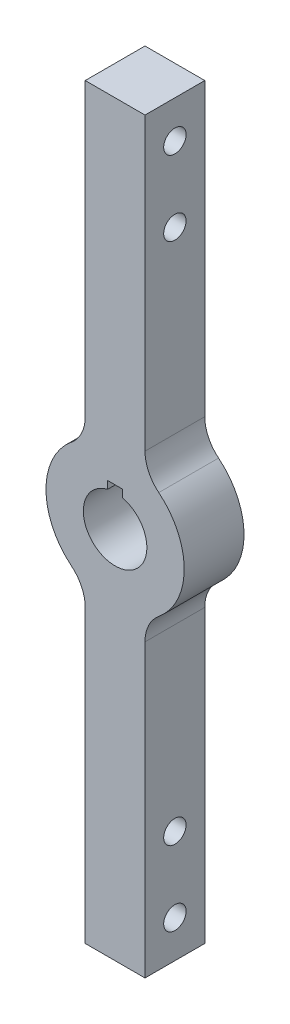
ISO-10303-21;
HEADER;
FILE_DESCRIPTION(('STEP AP214'),'2;1');
FILE_NAME('part.step','',(''),(''),'','','');
FILE_SCHEMA(('AUTOMOTIVE_DESIGN { 1 0 10303 214 1 1 1 1 }'));
ENDSEC;
DATA;
#1=APPLICATION_CONTEXT('core data for automotive mechanical design processes');
#2=APPLICATION_PROTOCOL_DEFINITION('international standard','automotive_design',2000,#1);
#3=PRODUCT_CONTEXT('',#1,'mechanical');
#4=PRODUCT('Part','Part','',(#3));
#5=PRODUCT_RELATED_PRODUCT_CATEGORY('part','',(#4));
#6=PRODUCT_DEFINITION_FORMATION('','',#4);
#7=PRODUCT_DEFINITION_CONTEXT('part definition',#1,'design');
#8=PRODUCT_DEFINITION('design','',#6,#7);
#9=PRODUCT_DEFINITION_SHAPE('','',#8);
#10=(LENGTH_UNIT() NAMED_UNIT(*) SI_UNIT(.MILLI.,.METRE.));
#11=(NAMED_UNIT(*) PLANE_ANGLE_UNIT() SI_UNIT($,.RADIAN.));
#12=(NAMED_UNIT(*) SI_UNIT($,.STERADIAN.) SOLID_ANGLE_UNIT());
#13=UNCERTAINTY_MEASURE_WITH_UNIT(LENGTH_MEASURE(1.E-05),#10,'distance_accuracy_value','');
#14=(GEOMETRIC_REPRESENTATION_CONTEXT(3) GLOBAL_UNCERTAINTY_ASSIGNED_CONTEXT((#13)) GLOBAL_UNIT_ASSIGNED_CONTEXT((#10,
#11,#12)) REPRESENTATION_CONTEXT('',''));
#15=CARTESIAN_POINT('',(0.,0.,0.));
#16=DIRECTION('',(0.,0.,1.));
#17=DIRECTION('',(1.,0.,0.));
#18=AXIS2_PLACEMENT_3D('',#15,#16,#17);
#19=CARTESIAN_POINT('',(0.,0.,8.));
#20=DIRECTION('',(0.,0.,-1.));
#21=DIRECTION('',(-1.,0.,0.));
#22=AXIS2_PLACEMENT_3D('',#19,#20,#21);
#23=CYLINDRICAL_SURFACE('',#22,18.5);
#24=CARTESIAN_POINT('',(0.,0.,8.));
#25=DIRECTION('',(0.,0.,1.));
#26=DIRECTION('',(1.,0.,0.));
#27=AXIS2_PLACEMENT_3D('',#24,#25,#26);
#28=CIRCLE('',#27,18.5);
#29=CARTESIAN_POINT('',(11.6842105263158,-14.3432640767969,8.));
#30=VERTEX_POINT('',#29);
#31=CARTESIAN_POINT('',(11.6842105263158,14.3432640767969,8.));
#32=VERTEX_POINT('',#31);
#33=EDGE_CURVE('E199',#30,#32,#28,.T.);
#34=ORIENTED_EDGE('',*,*,#33,.F.);
#35=DIRECTION('',(0.,0.,-1.));
#36=VECTOR('',#35,1.);
#37=CARTESIAN_POINT('',(11.6842105263158,-14.3432640767969,8.));
#38=LINE('',#37,#36);
#39=CARTESIAN_POINT('',(11.6842105263158,-14.3432640767969,-8.));
#40=VERTEX_POINT('',#39);
#41=EDGE_CURVE('E203',#30,#40,#38,.T.);
#42=ORIENTED_EDGE('',*,*,#41,.T.);
#43=CARTESIAN_POINT('',(0.,0.,-8.));
#44=DIRECTION('',(0.,0.,1.));
#45=DIRECTION('',(1.,0.,0.));
#46=AXIS2_PLACEMENT_3D('',#43,#44,#45);
#47=CIRCLE('',#46,18.5);
#48=CARTESIAN_POINT('',(11.6842105263158,14.3432640767969,-8.));
#49=VERTEX_POINT('',#48);
#50=EDGE_CURVE('E185',#40,#49,#47,.T.);
#51=ORIENTED_EDGE('',*,*,#50,.T.);
#52=DIRECTION('',(0.,0.,-1.));
#53=VECTOR('',#52,1.);
#54=CARTESIAN_POINT('',(11.6842105263158,14.3432640767969,8.));
#55=LINE('',#54,#53);
#56=EDGE_CURVE('E198',#49,#32,#55,.F.);
#57=ORIENTED_EDGE('',*,*,#56,.T.);
#58=EDGE_LOOP('',(#34,#42,#51,#57));
#59=FACE_BOUND('',#58,.T.);
#60=ADVANCED_FACE('F46',(#59),#23,.T.);
#61=CARTESIAN_POINT('',(-11.6842105263158,14.3432640767969,-8.));
#62=VERTEX_POINT('',#61);
#63=CARTESIAN_POINT('',(-11.6842105263158,-14.3432640767969,-8.));
#64=VERTEX_POINT('',#63);
#65=EDGE_CURVE('E189',#62,#64,#47,.T.);
#66=ORIENTED_EDGE('',*,*,#65,.T.);
#67=DIRECTION('',(0.,0.,-1.));
#68=VECTOR('',#67,1.);
#69=CARTESIAN_POINT('',(-11.6842105263158,-14.3432640767969,8.));
#70=LINE('',#69,#68);
#71=CARTESIAN_POINT('',(-11.6842105263158,-14.3432640767969,8.));
#72=VERTEX_POINT('',#71);
#73=EDGE_CURVE('E214',#64,#72,#70,.F.);
#74=ORIENTED_EDGE('',*,*,#73,.T.);
#75=CARTESIAN_POINT('',(-11.6842105263158,14.3432640767969,8.));
#76=VERTEX_POINT('',#75);
#77=EDGE_CURVE('E196',#76,#72,#28,.T.);
#78=ORIENTED_EDGE('',*,*,#77,.F.);
#79=DIRECTION('',(0.,0.,-1.));
#80=VECTOR('',#79,1.);
#81=CARTESIAN_POINT('',(-11.6842105263158,14.3432640767969,8.));
#82=LINE('',#81,#80);
#83=EDGE_CURVE('E211',#76,#62,#82,.T.);
#84=ORIENTED_EDGE('',*,*,#83,.T.);
#85=EDGE_LOOP('',(#66,#74,#78,#84));
#86=FACE_BOUND('',#85,.T.);
#87=ADVANCED_FACE('F332',(#86),#23,.T.);
#88=CARTESIAN_POINT('',(0.,0.,8.));
#89=DIRECTION('',(0.,0.,1.));
#90=DIRECTION('',(1.,0.,0.));
#91=AXIS2_PLACEMENT_3D('',#88,#89,#90);
#92=PLANE('',#91);
#93=DIRECTION('',(0.,-1.,0.));
#94=VECTOR('',#93,1.);
#95=CARTESIAN_POINT('',(2.,10.3,8.));
#96=LINE('',#95,#94);
#97=CARTESIAN_POINT('',(2.,10.3,8.));
#98=VERTEX_POINT('',#97);
#99=CARTESIAN_POINT('',(2.,8.26135582092915,8.));
#100=VERTEX_POINT('',#99);
#101=EDGE_CURVE('E163',#98,#100,#96,.T.);
#102=ORIENTED_EDGE('',*,*,#101,.T.);
#103=CARTESIAN_POINT('',(0.,0.,8.));
#104=DIRECTION('',(0.,0.,1.));
#105=DIRECTION('',(1.,0.,0.));
#106=AXIS2_PLACEMENT_3D('',#103,#104,#105);
#107=CIRCLE('',#106,8.5);
#108=CARTESIAN_POINT('',(-2.,8.26135582092915,8.));
#109=VERTEX_POINT('',#108);
#110=EDGE_CURVE('E178',#109,#100,#107,.T.);
#111=ORIENTED_EDGE('',*,*,#110,.F.);
#112=DIRECTION('',(0.,1.,0.));
#113=VECTOR('',#112,1.);
#114=CARTESIAN_POINT('',(-2.,10.3,8.));
#115=LINE('',#114,#113);
#116=CARTESIAN_POINT('',(-2.,10.3,8.));
#117=VERTEX_POINT('',#116);
#118=EDGE_CURVE('E180',#109,#117,#115,.T.);
#119=ORIENTED_EDGE('',*,*,#118,.T.);
#120=DIRECTION('',(1.,0.,0.));
#121=VECTOR('',#120,1.);
#122=CARTESIAN_POINT('',(-2.,10.3,8.));
#123=LINE('',#122,#121);
#124=EDGE_CURVE('E172',#117,#98,#123,.T.);
#125=ORIENTED_EDGE('',*,*,#124,.T.);
#126=EDGE_LOOP('',(#102,#111,#119,#125));
#127=FACE_BOUND('',#126,.T.);
#128=DIRECTION('',(0.,-1.,0.));
#129=VECTOR('',#128,1.);
#130=CARTESIAN_POINT('',(-8.,100.,8.));
#131=LINE('',#130,#129);
#132=CARTESIAN_POINT('',(-8.,100.,8.));
#133=VERTEX_POINT('',#132);
#134=CARTESIAN_POINT('',(-7.99999999999999,22.0963797939844,8.));
#135=VERTEX_POINT('',#134);
#136=EDGE_CURVE('E296',#133,#135,#131,.T.);
#137=ORIENTED_EDGE('',*,*,#136,.T.);
#138=CARTESIAN_POINT('',(-18.,22.0963797939844,8.));
#139=DIRECTION('',(0.,0.,1.));
#140=DIRECTION('',(1.,0.,0.));
#141=AXIS2_PLACEMENT_3D('',#138,#139,#140);
#142=CIRCLE('',#141,10.);
#143=EDGE_CURVE('E230',#135,#76,#142,.F.);
#144=ORIENTED_EDGE('',*,*,#143,.T.);
#145=ORIENTED_EDGE('',*,*,#77,.T.);
#146=CARTESIAN_POINT('',(-18.,-22.0963797939843,8.));
#147=DIRECTION('',(0.,0.,1.));
#148=DIRECTION('',(1.,0.,0.));
#149=AXIS2_PLACEMENT_3D('',#146,#147,#148);
#150=CIRCLE('',#149,10.);
#151=CARTESIAN_POINT('',(-8.00000000000001,-22.0963797939844,8.));
#152=VERTEX_POINT('',#151);
#153=EDGE_CURVE('E226',#72,#152,#150,.F.);
#154=ORIENTED_EDGE('',*,*,#153,.T.);
#155=DIRECTION('',(0.,-1.,0.));
#156=VECTOR('',#155,1.);
#157=CARTESIAN_POINT('',(-7.99999999999999,-100.,8.));
#158=LINE('',#157,#156);
#159=CARTESIAN_POINT('',(-7.99999999999999,-100.,8.));
#160=VERTEX_POINT('',#159);
#161=EDGE_CURVE('E274',#152,#160,#158,.T.);
#162=ORIENTED_EDGE('',*,*,#161,.T.);
#163=DIRECTION('',(1.,0.,0.));
#164=VECTOR('',#163,1.);
#165=CARTESIAN_POINT('',(-7.99999999999999,-100.,8.));
#166=LINE('',#165,#164);
#167=CARTESIAN_POINT('',(8.00000000000001,-100.,8.));
#168=VERTEX_POINT('',#167);
#169=EDGE_CURVE('E277',#160,#168,#166,.T.);
#170=ORIENTED_EDGE('',*,*,#169,.T.);
#171=DIRECTION('',(0.,1.,0.));
#172=VECTOR('',#171,1.);
#173=CARTESIAN_POINT('',(8.00000000000001,-100.,8.));
#174=LINE('',#173,#172);
#175=CARTESIAN_POINT('',(8.00000000000001,-22.0963797939843,8.));
#176=VERTEX_POINT('',#175);
#177=EDGE_CURVE('E271',#168,#176,#174,.T.);
#178=ORIENTED_EDGE('',*,*,#177,.T.);
#179=CARTESIAN_POINT('',(18.,-22.0963797939843,8.));
#180=DIRECTION('',(0.,0.,1.));
#181=DIRECTION('',(1.,0.,0.));
#182=AXIS2_PLACEMENT_3D('',#179,#180,#181);
#183=CIRCLE('',#182,10.);
#184=EDGE_CURVE('E222',#176,#30,#183,.F.);
#185=ORIENTED_EDGE('',*,*,#184,.T.);
#186=ORIENTED_EDGE('',*,*,#33,.T.);
#187=CARTESIAN_POINT('',(18.,22.0963797939844,8.));
#188=DIRECTION('',(0.,0.,1.));
#189=DIRECTION('',(1.,0.,0.));
#190=AXIS2_PLACEMENT_3D('',#187,#188,#189);
#191=CIRCLE('',#190,10.);
#192=CARTESIAN_POINT('',(7.99999999999999,22.0963797939844,8.));
#193=VERTEX_POINT('',#192);
#194=EDGE_CURVE('E13',#32,#193,#191,.F.);
#195=ORIENTED_EDGE('',*,*,#194,.T.);
#196=DIRECTION('',(0.,1.,0.));
#197=VECTOR('',#196,1.);
#198=CARTESIAN_POINT('',(8.,100.,8.));
#199=LINE('',#198,#197);
#200=CARTESIAN_POINT('',(8.,100.,8.));
#201=VERTEX_POINT('',#200);
#202=EDGE_CURVE('E291',#193,#201,#199,.T.);
#203=ORIENTED_EDGE('',*,*,#202,.T.);
#204=DIRECTION('',(-1.,0.,0.));
#205=VECTOR('',#204,1.);
#206=CARTESIAN_POINT('',(-8.,100.,8.));
#207=LINE('',#206,#205);
#208=EDGE_CURVE('E293',#201,#133,#207,.T.);
#209=ORIENTED_EDGE('',*,*,#208,.T.);
#210=EDGE_LOOP('',(#137,#144,#145,#154,#162,#170,#178,#185,#186,#195,#203,#209));
#211=FACE_BOUND('',#210,.T.);
#212=ADVANCED_FACE('F176',(#127,#211),#92,.T.);
#213=CARTESIAN_POINT('',(0.,0.,-8.));
#214=DIRECTION('',(0.,0.,1.));
#215=DIRECTION('',(1.,0.,0.));
#216=AXIS2_PLACEMENT_3D('',#213,#214,#215);
#217=PLANE('',#216);
#218=ORIENTED_EDGE('',*,*,#50,.F.);
#219=CARTESIAN_POINT('',(18.,-22.0963797939843,-8.));
#220=DIRECTION('',(0.,0.,1.));
#221=DIRECTION('',(1.,0.,0.));
#222=AXIS2_PLACEMENT_3D('',#219,#220,#221);
#223=CIRCLE('',#222,10.);
#224=CARTESIAN_POINT('',(8.00000000000001,-22.0963797939843,-8.));
#225=VERTEX_POINT('',#224);
#226=EDGE_CURVE('E220',#40,#225,#223,.T.);
#227=ORIENTED_EDGE('',*,*,#226,.T.);
#228=DIRECTION('',(0.,1.,0.));
#229=VECTOR('',#228,1.);
#230=CARTESIAN_POINT('',(8.00000000000001,-100.,-8.));
#231=LINE('',#230,#229);
#232=CARTESIAN_POINT('',(8.00000000000001,-100.,-8.));
#233=VERTEX_POINT('',#232);
#234=EDGE_CURVE('E267',#233,#225,#231,.T.);
#235=ORIENTED_EDGE('',*,*,#234,.F.);
#236=DIRECTION('',(1.,0.,0.));
#237=VECTOR('',#236,1.);
#238=CARTESIAN_POINT('',(-7.99999999999999,-100.,-8.));
#239=LINE('',#238,#237);
#240=CARTESIAN_POINT('',(-7.99999999999999,-100.,-8.));
#241=VERTEX_POINT('',#240);
#242=EDGE_CURVE('E275',#241,#233,#239,.T.);
#243=ORIENTED_EDGE('',*,*,#242,.F.);
#244=DIRECTION('',(0.,-1.,0.));
#245=VECTOR('',#244,1.);
#246=CARTESIAN_POINT('',(-7.99999999999999,-100.,-8.));
#247=LINE('',#246,#245);
#248=CARTESIAN_POINT('',(-8.00000000000001,-22.0963797939844,-8.));
#249=VERTEX_POINT('',#248);
#250=EDGE_CURVE('E282',#249,#241,#247,.T.);
#251=ORIENTED_EDGE('',*,*,#250,.F.);
#252=CARTESIAN_POINT('',(-18.,-22.0963797939843,-8.));
#253=DIRECTION('',(0.,0.,1.));
#254=DIRECTION('',(1.,0.,0.));
#255=AXIS2_PLACEMENT_3D('',#252,#253,#254);
#256=CIRCLE('',#255,10.);
#257=EDGE_CURVE('E224',#249,#64,#256,.T.);
#258=ORIENTED_EDGE('',*,*,#257,.T.);
#259=ORIENTED_EDGE('',*,*,#65,.F.);
#260=CARTESIAN_POINT('',(-18.,22.0963797939844,-8.));
#261=DIRECTION('',(0.,0.,1.));
#262=DIRECTION('',(1.,0.,0.));
#263=AXIS2_PLACEMENT_3D('',#260,#261,#262);
#264=CIRCLE('',#263,10.);
#265=CARTESIAN_POINT('',(-7.99999999999999,22.0963797939844,-8.));
#266=VERTEX_POINT('',#265);
#267=EDGE_CURVE('E228',#62,#266,#264,.T.);
#268=ORIENTED_EDGE('',*,*,#267,.T.);
#269=DIRECTION('',(0.,-1.,0.));
#270=VECTOR('',#269,1.);
#271=CARTESIAN_POINT('',(-8.,100.,-8.));
#272=LINE('',#271,#270);
#273=CARTESIAN_POINT('',(-8.,100.,-8.));
#274=VERTEX_POINT('',#273);
#275=EDGE_CURVE('E294',#274,#266,#272,.T.);
#276=ORIENTED_EDGE('',*,*,#275,.F.);
#277=DIRECTION('',(-1.,0.,0.));
#278=VECTOR('',#277,1.);
#279=CARTESIAN_POINT('',(-8.,100.,-8.));
#280=LINE('',#279,#278);
#281=CARTESIAN_POINT('',(8.,100.,-8.));
#282=VERTEX_POINT('',#281);
#283=EDGE_CURVE('E301',#282,#274,#280,.T.);
#284=ORIENTED_EDGE('',*,*,#283,.F.);
#285=DIRECTION('',(0.,1.,0.));
#286=VECTOR('',#285,1.);
#287=CARTESIAN_POINT('',(8.,100.,-8.));
#288=LINE('',#287,#286);
#289=CARTESIAN_POINT('',(7.99999999999999,22.0963797939844,-8.));
#290=VERTEX_POINT('',#289);
#291=EDGE_CURVE('E290',#290,#282,#288,.T.);
#292=ORIENTED_EDGE('',*,*,#291,.F.);
#293=CARTESIAN_POINT('',(18.,22.0963797939844,-8.));
#294=DIRECTION('',(0.,0.,1.));
#295=DIRECTION('',(1.,0.,0.));
#296=AXIS2_PLACEMENT_3D('',#293,#294,#295);
#297=CIRCLE('',#296,10.);
#298=EDGE_CURVE('E55',#290,#49,#297,.T.);
#299=ORIENTED_EDGE('',*,*,#298,.T.);
#300=EDGE_LOOP('',(#218,#227,#235,#243,#251,#258,#259,#268,#276,#284,#292,#299));
#301=FACE_BOUND('',#300,.T.);
#302=CARTESIAN_POINT('',(0.,0.,-8.));
#303=DIRECTION('',(0.,0.,1.));
#304=DIRECTION('',(1.,0.,0.));
#305=AXIS2_PLACEMENT_3D('',#302,#303,#304);
#306=CIRCLE('',#305,8.5);
#307=CARTESIAN_POINT('',(-2.,8.26135582092915,-8.));
#308=VERTEX_POINT('',#307);
#309=CARTESIAN_POINT('',(2.,8.26135582092915,-8.));
#310=VERTEX_POINT('',#309);
#311=EDGE_CURVE('E186',#308,#310,#306,.T.);
#312=ORIENTED_EDGE('',*,*,#311,.T.);
#313=DIRECTION('',(0.,-1.,0.));
#314=VECTOR('',#313,1.);
#315=CARTESIAN_POINT('',(2.,10.3,-8.));
#316=LINE('',#315,#314);
#317=CARTESIAN_POINT('',(2.,10.3,-8.));
#318=VERTEX_POINT('',#317);
#319=EDGE_CURVE('E166',#318,#310,#316,.T.);
#320=ORIENTED_EDGE('',*,*,#319,.F.);
#321=DIRECTION('',(1.,0.,0.));
#322=VECTOR('',#321,1.);
#323=CARTESIAN_POINT('',(-2.,10.3,-8.));
#324=LINE('',#323,#322);
#325=CARTESIAN_POINT('',(-2.,10.3,-8.));
#326=VERTEX_POINT('',#325);
#327=EDGE_CURVE('E181',#326,#318,#324,.T.);
#328=ORIENTED_EDGE('',*,*,#327,.F.);
#329=DIRECTION('',(0.,1.,0.));
#330=VECTOR('',#329,1.);
#331=CARTESIAN_POINT('',(-2.,10.3,-8.));
#332=LINE('',#331,#330);
#333=EDGE_CURVE('E260',#308,#326,#332,.T.);
#334=ORIENTED_EDGE('',*,*,#333,.F.);
#335=EDGE_LOOP('',(#312,#320,#328,#334));
#336=FACE_BOUND('',#335,.T.);
#337=ADVANCED_FACE('F320',(#301,#336),#217,.F.);
#338=CARTESIAN_POINT('',(0.,0.,8.));
#339=DIRECTION('',(0.,0.,-1.));
#340=DIRECTION('',(-1.,0.,0.));
#341=AXIS2_PLACEMENT_3D('',#338,#339,#340);
#342=CYLINDRICAL_SURFACE('',#341,8.5);
#343=DIRECTION('',(0.,0.,-1.));
#344=VECTOR('',#343,1.);
#345=CARTESIAN_POINT('',(-2.,8.26135582092915,8.));
#346=LINE('',#345,#344);
#347=EDGE_CURVE('E171',#109,#308,#346,.T.);
#348=ORIENTED_EDGE('',*,*,#347,.F.);
#349=ORIENTED_EDGE('',*,*,#110,.T.);
#350=DIRECTION('',(0.,0.,-1.));
#351=VECTOR('',#350,1.);
#352=CARTESIAN_POINT('',(2.,8.26135582092915,8.));
#353=LINE('',#352,#351);
#354=EDGE_CURVE('E160',#100,#310,#353,.T.);
#355=ORIENTED_EDGE('',*,*,#354,.T.);
#356=ORIENTED_EDGE('',*,*,#311,.F.);
#357=EDGE_LOOP('',(#348,#349,#355,#356));
#358=FACE_BOUND('',#357,.T.);
#359=ADVANCED_FACE('F184',(#358),#342,.F.);
#360=CARTESIAN_POINT('',(8.,100.,8.));
#361=DIRECTION('',(-1.,0.,0.));
#362=DIRECTION('',(0.,-1.,0.));
#363=AXIS2_PLACEMENT_3D('',#360,#361,#362);
#364=PLANE('',#363);
#365=CARTESIAN_POINT('',(8.00000000000001,70.,0.));
#366=DIRECTION('',(1.,0.,0.));
#367=DIRECTION('',(0.,1.,0.));
#368=AXIS2_PLACEMENT_3D('',#365,#366,#367);
#369=CIRCLE('',#368,3.);
#370=CARTESIAN_POINT('',(8.00000000000001,73.,0.));
#371=VERTEX_POINT('',#370);
#372=EDGE_CURVE('E239',#371,#371,#369,.T.);
#373=ORIENTED_EDGE('',*,*,#372,.F.);
#374=EDGE_LOOP('',(#373));
#375=FACE_BOUND('',#374,.T.);
#376=CARTESIAN_POINT('',(8.,90.,0.));
#377=DIRECTION('',(1.,0.,0.));
#378=DIRECTION('',(0.,1.,0.));
#379=AXIS2_PLACEMENT_3D('',#376,#377,#378);
#380=CIRCLE('',#379,3.);
#381=CARTESIAN_POINT('',(8.,93.,0.));
#382=VERTEX_POINT('',#381);
#383=EDGE_CURVE('E236',#382,#382,#380,.T.);
#384=ORIENTED_EDGE('',*,*,#383,.F.);
#385=EDGE_LOOP('',(#384));
#386=FACE_BOUND('',#385,.T.);
#387=ORIENTED_EDGE('',*,*,#202,.F.);
#388=DIRECTION('',(0.,0.,1.));
#389=VECTOR('',#388,1.);
#390=CARTESIAN_POINT('',(7.99999999999999,22.0963797939844,-8.));
#391=LINE('',#390,#389);
#392=EDGE_CURVE('E218',#193,#290,#391,.F.);
#393=ORIENTED_EDGE('',*,*,#392,.T.);
#394=ORIENTED_EDGE('',*,*,#291,.T.);
#395=DIRECTION('',(0.,0.,-1.));
#396=VECTOR('',#395,1.);
#397=CARTESIAN_POINT('',(8.,100.,8.));
#398=LINE('',#397,#396);
#399=EDGE_CURVE('E191',#201,#282,#398,.T.);
#400=ORIENTED_EDGE('',*,*,#399,.F.);
#401=EDGE_LOOP('',(#387,#393,#394,#400));
#402=FACE_BOUND('',#401,.T.);
#403=ADVANCED_FACE('F316',(#375,#386,#402),#364,.F.);
#404=CARTESIAN_POINT('',(-8.,100.,8.));
#405=DIRECTION('',(0.,-1.,0.));
#406=DIRECTION('',(0.,0.,-1.));
#407=AXIS2_PLACEMENT_3D('',#404,#405,#406);
#408=PLANE('',#407);
#409=ORIENTED_EDGE('',*,*,#283,.T.);
#410=DIRECTION('',(0.,0.,-1.));
#411=VECTOR('',#410,1.);
#412=CARTESIAN_POINT('',(-8.,100.,8.));
#413=LINE('',#412,#411);
#414=EDGE_CURVE('E299',#133,#274,#413,.T.);
#415=ORIENTED_EDGE('',*,*,#414,.F.);
#416=ORIENTED_EDGE('',*,*,#208,.F.);
#417=ORIENTED_EDGE('',*,*,#399,.T.);
#418=EDGE_LOOP('',(#409,#415,#416,#417));
#419=FACE_BOUND('',#418,.T.);
#420=ADVANCED_FACE('F313',(#419),#408,.F.);
#421=CARTESIAN_POINT('',(-8.,100.,8.));
#422=DIRECTION('',(1.,0.,0.));
#423=DIRECTION('',(0.,1.,0.));
#424=AXIS2_PLACEMENT_3D('',#421,#422,#423);
#425=PLANE('',#424);
#426=CARTESIAN_POINT('',(-8.,70.,0.));
#427=DIRECTION('',(1.,0.,0.));
#428=DIRECTION('',(0.,1.,0.));
#429=AXIS2_PLACEMENT_3D('',#426,#427,#428);
#430=CIRCLE('',#429,3.);
#431=CARTESIAN_POINT('',(-8.,73.,0.));
#432=VERTEX_POINT('',#431);
#433=EDGE_CURVE('E237',#432,#432,#430,.T.);
#434=ORIENTED_EDGE('',*,*,#433,.T.);
#435=EDGE_LOOP('',(#434));
#436=FACE_BOUND('',#435,.T.);
#437=CARTESIAN_POINT('',(-8.,90.,0.));
#438=DIRECTION('',(1.,0.,0.));
#439=DIRECTION('',(0.,1.,0.));
#440=AXIS2_PLACEMENT_3D('',#437,#438,#439);
#441=CIRCLE('',#440,3.);
#442=CARTESIAN_POINT('',(-8.,93.,0.));
#443=VERTEX_POINT('',#442);
#444=EDGE_CURVE('E233',#443,#443,#441,.T.);
#445=ORIENTED_EDGE('',*,*,#444,.T.);
#446=EDGE_LOOP('',(#445));
#447=FACE_BOUND('',#446,.T.);
#448=ORIENTED_EDGE('',*,*,#275,.T.);
#449=DIRECTION('',(0.,0.,1.));
#450=VECTOR('',#449,1.);
#451=CARTESIAN_POINT('',(-7.99999999999999,22.0963797939844,8.));
#452=LINE('',#451,#450);
#453=EDGE_CURVE('E216',#266,#135,#452,.T.);
#454=ORIENTED_EDGE('',*,*,#453,.T.);
#455=ORIENTED_EDGE('',*,*,#136,.F.);
#456=ORIENTED_EDGE('',*,*,#414,.T.);
#457=EDGE_LOOP('',(#448,#454,#455,#456));
#458=FACE_BOUND('',#457,.T.);
#459=ADVANCED_FACE('F324',(#436,#447,#458),#425,.F.);
#460=CARTESIAN_POINT('',(8.00000000000001,-100.,8.));
#461=DIRECTION('',(-1.,0.,0.));
#462=DIRECTION('',(0.,0.,1.));
#463=AXIS2_PLACEMENT_3D('',#460,#461,#462);
#464=PLANE('',#463);
#465=CARTESIAN_POINT('',(8.00000000000002,-90.,0.));
#466=DIRECTION('',(1.,0.,0.));
#467=DIRECTION('',(0.,1.,0.));
#468=AXIS2_PLACEMENT_3D('',#465,#466,#467);
#469=CIRCLE('',#468,3.);
#470=CARTESIAN_POINT('',(8.00000000000002,-87.,0.));
#471=VERTEX_POINT('',#470);
#472=EDGE_CURVE('E252',#471,#471,#469,.T.);
#473=ORIENTED_EDGE('',*,*,#472,.F.);
#474=EDGE_LOOP('',(#473));
#475=FACE_BOUND('',#474,.T.);
#476=CARTESIAN_POINT('',(8.00000000000002,-70.,0.));
#477=DIRECTION('',(1.,0.,0.));
#478=DIRECTION('',(0.,1.,0.));
#479=AXIS2_PLACEMENT_3D('',#476,#477,#478);
#480=CIRCLE('',#479,3.);
#481=CARTESIAN_POINT('',(8.00000000000002,-67.,0.));
#482=VERTEX_POINT('',#481);
#483=EDGE_CURVE('E242',#482,#482,#480,.T.);
#484=ORIENTED_EDGE('',*,*,#483,.F.);
#485=EDGE_LOOP('',(#484));
#486=FACE_BOUND('',#485,.T.);
#487=ORIENTED_EDGE('',*,*,#234,.T.);
#488=DIRECTION('',(0.,0.,1.));
#489=VECTOR('',#488,1.);
#490=CARTESIAN_POINT('',(8.00000000000001,-22.0963797939843,8.));
#491=LINE('',#490,#489);
#492=EDGE_CURVE('E206',#225,#176,#491,.T.);
#493=ORIENTED_EDGE('',*,*,#492,.T.);
#494=ORIENTED_EDGE('',*,*,#177,.F.);
#495=DIRECTION('',(0.,0.,-1.));
#496=VECTOR('',#495,1.);
#497=CARTESIAN_POINT('',(8.00000000000001,-100.,8.));
#498=LINE('',#497,#496);
#499=EDGE_CURVE('E279',#168,#233,#498,.T.);
#500=ORIENTED_EDGE('',*,*,#499,.T.);
#501=EDGE_LOOP('',(#487,#493,#494,#500));
#502=FACE_BOUND('',#501,.T.);
#503=ADVANCED_FACE('F357',(#475,#486,#502),#464,.F.);
#504=CARTESIAN_POINT('',(-7.99999999999999,-100.,8.));
#505=DIRECTION('',(1.,0.,0.));
#506=DIRECTION('',(0.,1.,0.));
#507=AXIS2_PLACEMENT_3D('',#504,#505,#506);
#508=PLANE('',#507);
#509=CARTESIAN_POINT('',(-7.99999999999999,-90.,0.));
#510=DIRECTION('',(1.,0.,0.));
#511=DIRECTION('',(0.,1.,0.));
#512=AXIS2_PLACEMENT_3D('',#509,#510,#511);
#513=CIRCLE('',#512,3.);
#514=CARTESIAN_POINT('',(-7.99999999999999,-87.,0.));
#515=VERTEX_POINT('',#514);
#516=EDGE_CURVE('E50',#515,#515,#513,.T.);
#517=ORIENTED_EDGE('',*,*,#516,.T.);
#518=EDGE_LOOP('',(#517));
#519=FACE_BOUND('',#518,.T.);
#520=CARTESIAN_POINT('',(-7.99999999999999,-70.,0.));
#521=DIRECTION('',(1.,0.,0.));
#522=DIRECTION('',(0.,1.,0.));
#523=AXIS2_PLACEMENT_3D('',#520,#521,#522);
#524=CIRCLE('',#523,3.);
#525=CARTESIAN_POINT('',(-7.99999999999999,-67.,0.));
#526=VERTEX_POINT('',#525);
#527=EDGE_CURVE('E240',#526,#526,#524,.T.);
#528=ORIENTED_EDGE('',*,*,#527,.T.);
#529=EDGE_LOOP('',(#528));
#530=FACE_BOUND('',#529,.T.);
#531=ORIENTED_EDGE('',*,*,#161,.F.);
#532=DIRECTION('',(0.,0.,1.));
#533=VECTOR('',#532,1.);
#534=CARTESIAN_POINT('',(-8.00000000000001,-22.0963797939843,-8.));
#535=LINE('',#534,#533);
#536=EDGE_CURVE('E208',#152,#249,#535,.F.);
#537=ORIENTED_EDGE('',*,*,#536,.T.);
#538=ORIENTED_EDGE('',*,*,#250,.T.);
#539=DIRECTION('',(0.,0.,-1.));
#540=VECTOR('',#539,1.);
#541=CARTESIAN_POINT('',(-7.99999999999999,-100.,8.));
#542=LINE('',#541,#540);
#543=EDGE_CURVE('E287',#160,#241,#542,.T.);
#544=ORIENTED_EDGE('',*,*,#543,.F.);
#545=EDGE_LOOP('',(#531,#537,#538,#544));
#546=FACE_BOUND('',#545,.T.);
#547=ADVANCED_FACE('F340',(#519,#530,#546),#508,.F.);
#548=CARTESIAN_POINT('',(-7.99999999999999,-100.,8.));
#549=DIRECTION('',(0.,1.,0.));
#550=DIRECTION('',(0.,0.,1.));
#551=AXIS2_PLACEMENT_3D('',#548,#549,#550);
#552=PLANE('',#551);
#553=ORIENTED_EDGE('',*,*,#242,.T.);
#554=ORIENTED_EDGE('',*,*,#499,.F.);
#555=ORIENTED_EDGE('',*,*,#169,.F.);
#556=ORIENTED_EDGE('',*,*,#543,.T.);
#557=EDGE_LOOP('',(#553,#554,#555,#556));
#558=FACE_BOUND('',#557,.T.);
#559=ADVANCED_FACE('F346',(#558),#552,.F.);
#560=CARTESIAN_POINT('',(2.,10.3,8.));
#561=DIRECTION('',(1.,0.,0.));
#562=DIRECTION('',(0.,1.,0.));
#563=AXIS2_PLACEMENT_3D('',#560,#561,#562);
#564=PLANE('',#563);
#565=ORIENTED_EDGE('',*,*,#319,.T.);
#566=ORIENTED_EDGE('',*,*,#354,.F.);
#567=ORIENTED_EDGE('',*,*,#101,.F.);
#568=DIRECTION('',(0.,0.,-1.));
#569=VECTOR('',#568,1.);
#570=CARTESIAN_POINT('',(2.,10.3,8.));
#571=LINE('',#570,#569);
#572=EDGE_CURVE('E265',#98,#318,#571,.T.);
#573=ORIENTED_EDGE('',*,*,#572,.T.);
#574=EDGE_LOOP('',(#565,#566,#567,#573));
#575=FACE_BOUND('',#574,.T.);
#576=ADVANCED_FACE('F162',(#575),#564,.F.);
#577=CARTESIAN_POINT('',(-2.,10.3,8.));
#578=DIRECTION('',(0.,1.,0.));
#579=DIRECTION('',(0.,0.,1.));
#580=AXIS2_PLACEMENT_3D('',#577,#578,#579);
#581=PLANE('',#580);
#582=ORIENTED_EDGE('',*,*,#327,.T.);
#583=ORIENTED_EDGE('',*,*,#572,.F.);
#584=ORIENTED_EDGE('',*,*,#124,.F.);
#585=DIRECTION('',(0.,0.,-1.));
#586=VECTOR('',#585,1.);
#587=CARTESIAN_POINT('',(-2.,10.3,8.));
#588=LINE('',#587,#586);
#589=EDGE_CURVE('E268',#117,#326,#588,.T.);
#590=ORIENTED_EDGE('',*,*,#589,.T.);
#591=EDGE_LOOP('',(#582,#583,#584,#590));
#592=FACE_BOUND('',#591,.T.);
#593=ADVANCED_FACE('F403',(#592),#581,.F.);
#594=CARTESIAN_POINT('',(-2.,10.3,8.));
#595=DIRECTION('',(-1.,0.,0.));
#596=DIRECTION('',(0.,-1.,0.));
#597=AXIS2_PLACEMENT_3D('',#594,#595,#596);
#598=PLANE('',#597);
#599=ORIENTED_EDGE('',*,*,#333,.T.);
#600=ORIENTED_EDGE('',*,*,#589,.F.);
#601=ORIENTED_EDGE('',*,*,#118,.F.);
#602=ORIENTED_EDGE('',*,*,#347,.T.);
#603=EDGE_LOOP('',(#599,#600,#601,#602));
#604=FACE_BOUND('',#603,.T.);
#605=ADVANCED_FACE('F381',(#604),#598,.F.);
#606=CARTESIAN_POINT('',(18.,-22.0963797939843,8.));
#607=DIRECTION('',(0.,0.,-1.));
#608=DIRECTION('',(-1.,0.,0.));
#609=AXIS2_PLACEMENT_3D('',#606,#607,#608);
#610=CYLINDRICAL_SURFACE('',#609,10.);
#611=ORIENTED_EDGE('',*,*,#184,.F.);
#612=ORIENTED_EDGE('',*,*,#492,.F.);
#613=ORIENTED_EDGE('',*,*,#226,.F.);
#614=ORIENTED_EDGE('',*,*,#41,.F.);
#615=EDGE_LOOP('',(#611,#612,#613,#614));
#616=FACE_BOUND('',#615,.T.);
#617=ADVANCED_FACE('F354',(#616),#610,.F.);
#618=CARTESIAN_POINT('',(-18.,-22.0963797939843,8.));
#619=DIRECTION('',(0.,0.,-1.));
#620=DIRECTION('',(-1.,0.,0.));
#621=AXIS2_PLACEMENT_3D('',#618,#619,#620);
#622=CYLINDRICAL_SURFACE('',#621,10.);
#623=ORIENTED_EDGE('',*,*,#153,.F.);
#624=ORIENTED_EDGE('',*,*,#73,.F.);
#625=ORIENTED_EDGE('',*,*,#257,.F.);
#626=ORIENTED_EDGE('',*,*,#536,.F.);
#627=EDGE_LOOP('',(#623,#624,#625,#626));
#628=FACE_BOUND('',#627,.T.);
#629=ADVANCED_FACE('F335',(#628),#622,.F.);
#630=CARTESIAN_POINT('',(-18.,22.0963797939844,8.));
#631=DIRECTION('',(0.,0.,-1.));
#632=DIRECTION('',(-1.,0.,0.));
#633=AXIS2_PLACEMENT_3D('',#630,#631,#632);
#634=CYLINDRICAL_SURFACE('',#633,10.);
#635=ORIENTED_EDGE('',*,*,#143,.F.);
#636=ORIENTED_EDGE('',*,*,#453,.F.);
#637=ORIENTED_EDGE('',*,*,#267,.F.);
#638=ORIENTED_EDGE('',*,*,#83,.F.);
#639=EDGE_LOOP('',(#635,#636,#637,#638));
#640=FACE_BOUND('',#639,.T.);
#641=ADVANCED_FACE('F327',(#640),#634,.F.);
#642=CARTESIAN_POINT('',(18.,22.0963797939844,8.));
#643=DIRECTION('',(0.,0.,-1.));
#644=DIRECTION('',(-1.,0.,0.));
#645=AXIS2_PLACEMENT_3D('',#642,#643,#644);
#646=CYLINDRICAL_SURFACE('',#645,10.);
#647=ORIENTED_EDGE('',*,*,#194,.F.);
#648=ORIENTED_EDGE('',*,*,#56,.F.);
#649=ORIENTED_EDGE('',*,*,#298,.F.);
#650=ORIENTED_EDGE('',*,*,#392,.F.);
#651=EDGE_LOOP('',(#647,#648,#649,#650));
#652=FACE_BOUND('',#651,.T.);
#653=ADVANCED_FACE('F48',(#652),#646,.F.);
#654=CARTESIAN_POINT('',(-18.5,90.,0.));
#655=DIRECTION('',(1.,0.,0.));
#656=DIRECTION('',(0.,1.,0.));
#657=AXIS2_PLACEMENT_3D('',#654,#655,#656);
#658=CYLINDRICAL_SURFACE('',#657,3.);
#659=ORIENTED_EDGE('',*,*,#383,.T.);
#660=EDGE_LOOP('',(#659));
#661=FACE_BOUND('',#660,.T.);
#662=ORIENTED_EDGE('',*,*,#444,.F.);
#663=EDGE_LOOP('',(#662));
#664=FACE_BOUND('',#663,.T.);
#665=ADVANCED_FACE('F387',(#661,#664),#658,.F.);
#666=CARTESIAN_POINT('',(-18.5,70.,0.));
#667=DIRECTION('',(1.,0.,0.));
#668=DIRECTION('',(0.,1.,0.));
#669=AXIS2_PLACEMENT_3D('',#666,#667,#668);
#670=CYLINDRICAL_SURFACE('',#669,3.);
#671=ORIENTED_EDGE('',*,*,#372,.T.);
#672=EDGE_LOOP('',(#671));
#673=FACE_BOUND('',#672,.T.);
#674=ORIENTED_EDGE('',*,*,#433,.F.);
#675=EDGE_LOOP('',(#674));
#676=FACE_BOUND('',#675,.T.);
#677=ADVANCED_FACE('F391',(#673,#676),#670,.F.);
#678=CARTESIAN_POINT('',(-18.5,-70.,0.));
#679=DIRECTION('',(1.,0.,0.));
#680=DIRECTION('',(0.,1.,0.));
#681=AXIS2_PLACEMENT_3D('',#678,#679,#680);
#682=CYLINDRICAL_SURFACE('',#681,3.);
#683=ORIENTED_EDGE('',*,*,#483,.T.);
#684=EDGE_LOOP('',(#683));
#685=FACE_BOUND('',#684,.T.);
#686=ORIENTED_EDGE('',*,*,#527,.F.);
#687=EDGE_LOOP('',(#686));
#688=FACE_BOUND('',#687,.T.);
#689=ADVANCED_FACE('F397',(#685,#688),#682,.F.);
#690=CARTESIAN_POINT('',(-18.5,-90.,0.));
#691=DIRECTION('',(1.,0.,0.));
#692=DIRECTION('',(0.,1.,0.));
#693=AXIS2_PLACEMENT_3D('',#690,#691,#692);
#694=CYLINDRICAL_SURFACE('',#693,3.);
#695=ORIENTED_EDGE('',*,*,#472,.T.);
#696=EDGE_LOOP('',(#695));
#697=FACE_BOUND('',#696,.T.);
#698=ORIENTED_EDGE('',*,*,#516,.F.);
#699=EDGE_LOOP('',(#698));
#700=FACE_BOUND('',#699,.T.);
#701=ADVANCED_FACE('F496',(#697,#700),#694,.F.);
#702=CLOSED_SHELL('',(#60,#87,#212,#337,#359,#403,#420,#459,#503,#547,#559,#576,#593,#605,#617,
#629,#641,#653,#665,#677,#689,#701));
#703=MANIFOLD_SOLID_BREP('B2',#702);
#704=ADVANCED_BREP_SHAPE_REPRESENTATION('',(#18,#703),#14);
#705=SHAPE_DEFINITION_REPRESENTATION(#9,#704);
ENDSEC;
END-ISO-10303-21;
